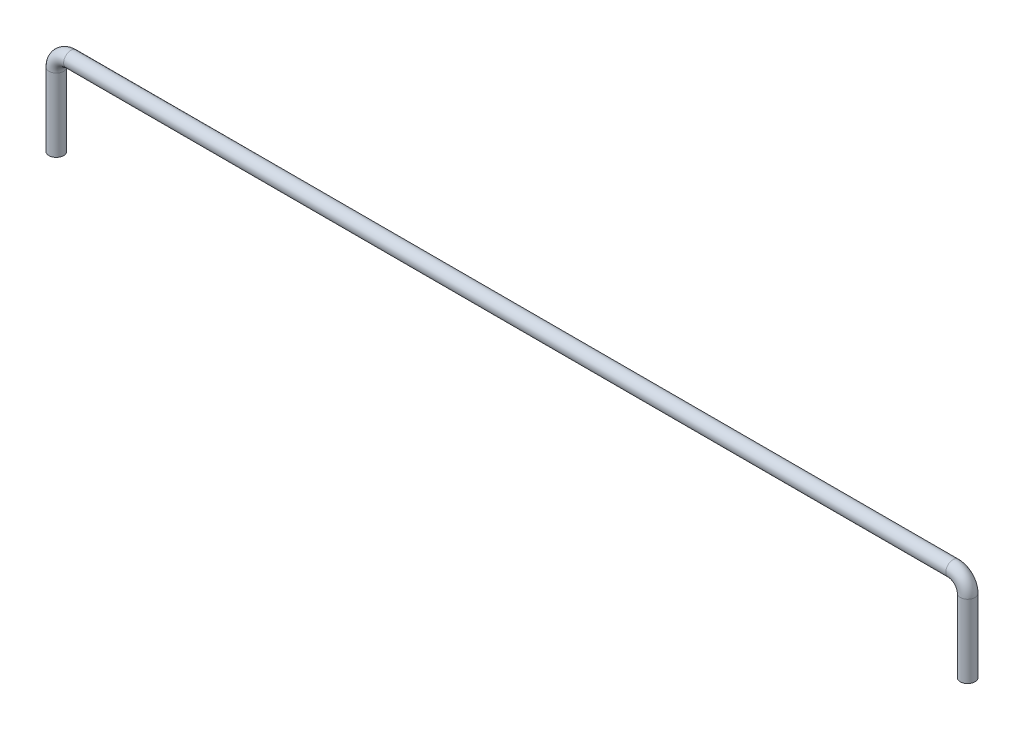
ISO-10303-21;
HEADER;
FILE_DESCRIPTION(('STEP AP214'),'2;1');
FILE_NAME('part.step','',(''),(''),'','','');
FILE_SCHEMA(('AUTOMOTIVE_DESIGN { 1 0 10303 214 1 1 1 1 }'));
ENDSEC;
DATA;
#1=APPLICATION_CONTEXT('core data for automotive mechanical design processes');
#2=APPLICATION_PROTOCOL_DEFINITION('international standard','automotive_design',2000,#1);
#3=PRODUCT_CONTEXT('',#1,'mechanical');
#4=PRODUCT('Part','Part','',(#3));
#5=PRODUCT_RELATED_PRODUCT_CATEGORY('part','',(#4));
#6=PRODUCT_DEFINITION_FORMATION('','',#4);
#7=PRODUCT_DEFINITION_CONTEXT('part definition',#1,'design');
#8=PRODUCT_DEFINITION('design','',#6,#7);
#9=PRODUCT_DEFINITION_SHAPE('','',#8);
#10=(LENGTH_UNIT() NAMED_UNIT(*) SI_UNIT(.MILLI.,.METRE.));
#11=(NAMED_UNIT(*) PLANE_ANGLE_UNIT() SI_UNIT($,.RADIAN.));
#12=(NAMED_UNIT(*) SI_UNIT($,.STERADIAN.) SOLID_ANGLE_UNIT());
#13=UNCERTAINTY_MEASURE_WITH_UNIT(LENGTH_MEASURE(1.E-05),#10,'distance_accuracy_value','');
#14=(GEOMETRIC_REPRESENTATION_CONTEXT(3) GLOBAL_UNCERTAINTY_ASSIGNED_CONTEXT((#13)) GLOBAL_UNIT_ASSIGNED_CONTEXT((#10,
#11,#12)) REPRESENTATION_CONTEXT('',''));
#15=CARTESIAN_POINT('',(0.,0.,0.));
#16=DIRECTION('',(0.,0.,1.));
#17=DIRECTION('',(1.,0.,0.));
#18=AXIS2_PLACEMENT_3D('',#15,#16,#17);
#19=CARTESIAN_POINT('',(0.,2.,0.));
#20=DIRECTION('',(0.,-1.,0.));
#21=DIRECTION('',(0.,0.,-1.));
#22=AXIS2_PLACEMENT_3D('',#19,#20,#21);
#23=CYLINDRICAL_SURFACE('',#22,0.25);
#24=CARTESIAN_POINT('',(0.,0.,0.));
#25=DIRECTION('',(0.,1.,0.));
#26=DIRECTION('',(0.,0.,1.));
#27=AXIS2_PLACEMENT_3D('',#24,#25,#26);
#28=CIRCLE('',#27,0.25);
#29=CARTESIAN_POINT('',(0.,0.,0.25));
#30=VERTEX_POINT('',#29);
#31=EDGE_CURVE('E10',#30,#30,#28,.T.);
#32=ORIENTED_EDGE('',*,*,#31,.T.);
#33=EDGE_LOOP('',(#32));
#34=FACE_BOUND('',#33,.T.);
#35=CARTESIAN_POINT('',(0.,2.5,0.));
#36=DIRECTION('',(0.,1.,0.));
#37=DIRECTION('',(0.,0.,1.));
#38=AXIS2_PLACEMENT_3D('',#35,#36,#37);
#39=CIRCLE('',#38,0.25);
#40=CARTESIAN_POINT('',(-0.25,2.5,0.));
#41=VERTEX_POINT('',#40);
#42=EDGE_CURVE('E63',#41,#41,#39,.T.);
#43=ORIENTED_EDGE('',*,*,#42,.F.);
#44=EDGE_LOOP('',(#43));
#45=FACE_BOUND('',#44,.T.);
#46=ADVANCED_FACE('F41',(#34,#45),#23,.T.);
#47=CARTESIAN_POINT('',(0.,0.,0.));
#48=DIRECTION('',(0.,1.,0.));
#49=DIRECTION('',(0.,0.,1.));
#50=AXIS2_PLACEMENT_3D('',#47,#48,#49);
#51=PLANE('',#50);
#52=ORIENTED_EDGE('',*,*,#31,.F.);
#53=EDGE_LOOP('',(#52));
#54=FACE_BOUND('',#53,.T.);
#55=ADVANCED_FACE('F70',(#54),#51,.F.);
#56=CARTESIAN_POINT('',(31.2,0.,0.));
#57=DIRECTION('',(0.,-1.,0.));
#58=DIRECTION('',(0.,0.,1.));
#59=AXIS2_PLACEMENT_3D('',#56,#57,#58);
#60=PLANE('',#59);
#61=CARTESIAN_POINT('',(31.2,0.,0.));
#62=DIRECTION('',(0.,-1.,0.));
#63=DIRECTION('',(0.,0.,1.));
#64=AXIS2_PLACEMENT_3D('',#61,#62,#63);
#65=CIRCLE('',#64,0.25);
#66=CARTESIAN_POINT('',(31.2,0.,0.25));
#67=VERTEX_POINT('',#66);
#68=EDGE_CURVE('E47',#67,#67,#65,.T.);
#69=ORIENTED_EDGE('',*,*,#68,.T.);
#70=EDGE_LOOP('',(#69));
#71=FACE_BOUND('',#70,.T.);
#72=ADVANCED_FACE('F75',(#71),#60,.T.);
#73=CARTESIAN_POINT('',(0.5,2.5,0.));
#74=DIRECTION('',(0.,0.,-1.));
#75=DIRECTION('',(-1.,0.,0.));
#76=AXIS2_PLACEMENT_3D('',#73,#74,#75);
#77=TOROIDAL_SURFACE('',#76,0.5,0.25);
#78=CARTESIAN_POINT('',(0.5,3.,0.));
#79=DIRECTION('',(1.,0.,0.));
#80=DIRECTION('',(0.,0.,1.));
#81=AXIS2_PLACEMENT_3D('',#78,#79,#80);
#82=CIRCLE('',#81,0.25);
#83=CARTESIAN_POINT('',(0.5,3.25,0.));
#84=VERTEX_POINT('',#83);
#85=EDGE_CURVE('E60',#84,#84,#82,.T.);
#86=CARTESIAN_POINT('',(0.5,2.5,0.));
#87=DIRECTION('',(0.,0.,-1.));
#88=DIRECTION('',(-1.,0.,0.));
#89=AXIS2_PLACEMENT_3D('',#86,#87,#88);
#90=CIRCLE('',#89,0.75);
#91=EDGE_CURVE('',#41,#84,#90,.T.);
#92=ORIENTED_EDGE('',*,*,#42,.T.);
#93=ORIENTED_EDGE('',*,*,#85,.F.);
#94=ORIENTED_EDGE('',*,*,#91,.T.);
#95=ORIENTED_EDGE('',*,*,#91,.F.);
#96=EDGE_LOOP('',(#92,#94,#93,#95));
#97=FACE_BOUND('',#96,.T.);
#98=ADVANCED_FACE('F67',(#97),#77,.T.);
#99=CARTESIAN_POINT('',(0.5,3.,0.));
#100=DIRECTION('',(1.,0.,0.));
#101=DIRECTION('',(0.,0.,-1.));
#102=AXIS2_PLACEMENT_3D('',#99,#100,#101);
#103=CYLINDRICAL_SURFACE('',#102,0.25);
#104=CARTESIAN_POINT('',(30.7,3.,0.));
#105=DIRECTION('',(1.,0.,0.));
#106=DIRECTION('',(0.,0.,1.));
#107=AXIS2_PLACEMENT_3D('',#104,#105,#106);
#108=CIRCLE('',#107,0.25);
#109=CARTESIAN_POINT('',(30.7,3.25,0.));
#110=VERTEX_POINT('',#109);
#111=EDGE_CURVE('E55',#110,#110,#108,.T.);
#112=ORIENTED_EDGE('',*,*,#111,.F.);
#113=EDGE_LOOP('',(#112));
#114=FACE_BOUND('',#113,.T.);
#115=ORIENTED_EDGE('',*,*,#85,.T.);
#116=EDGE_LOOP('',(#115));
#117=FACE_BOUND('',#116,.T.);
#118=ADVANCED_FACE('F88',(#114,#117),#103,.T.);
#119=CARTESIAN_POINT('',(30.7,2.5,0.));
#120=DIRECTION('',(0.,0.,-1.));
#121=DIRECTION('',(-1.,0.,0.));
#122=AXIS2_PLACEMENT_3D('',#119,#120,#121);
#123=TOROIDAL_SURFACE('',#122,0.5,0.25);
#124=CARTESIAN_POINT('',(31.2,2.5,0.));
#125=DIRECTION('',(0.,-1.,0.));
#126=DIRECTION('',(0.,0.,1.));
#127=AXIS2_PLACEMENT_3D('',#124,#125,#126);
#128=CIRCLE('',#127,0.25);
#129=CARTESIAN_POINT('',(31.45,2.5,0.));
#130=VERTEX_POINT('',#129);
#131=EDGE_CURVE('E51',#130,#130,#128,.T.);
#132=CARTESIAN_POINT('',(30.7,2.5,0.));
#133=DIRECTION('',(0.,0.,-1.));
#134=DIRECTION('',(-1.,0.,0.));
#135=AXIS2_PLACEMENT_3D('',#132,#133,#134);
#136=CIRCLE('',#135,0.75);
#137=EDGE_CURVE('',#110,#130,#136,.T.);
#138=ORIENTED_EDGE('',*,*,#111,.T.);
#139=ORIENTED_EDGE('',*,*,#131,.F.);
#140=ORIENTED_EDGE('',*,*,#137,.T.);
#141=ORIENTED_EDGE('',*,*,#137,.F.);
#142=EDGE_LOOP('',(#138,#140,#139,#141));
#143=FACE_BOUND('',#142,.T.);
#144=ADVANCED_FACE('F82',(#143),#123,.T.);
#145=CARTESIAN_POINT('',(31.2,2.5,0.));
#146=DIRECTION('',(0.,-1.,0.));
#147=DIRECTION('',(0.,0.,-1.));
#148=AXIS2_PLACEMENT_3D('',#145,#146,#147);
#149=CYLINDRICAL_SURFACE('',#148,0.25);
#150=ORIENTED_EDGE('',*,*,#68,.F.);
#151=EDGE_LOOP('',(#150));
#152=FACE_BOUND('',#151,.T.);
#153=ORIENTED_EDGE('',*,*,#131,.T.);
#154=EDGE_LOOP('',(#153));
#155=FACE_BOUND('',#154,.T.);
#156=ADVANCED_FACE('F77',(#152,#155),#149,.T.);
#157=CLOSED_SHELL('',(#46,#55,#72,#98,#118,#144,#156));
#158=MANIFOLD_SOLID_BREP('B2',#157);
#159=ADVANCED_BREP_SHAPE_REPRESENTATION('',(#18,#158),#14);
#160=SHAPE_DEFINITION_REPRESENTATION(#9,#159);
ENDSEC;
END-ISO-10303-21;
